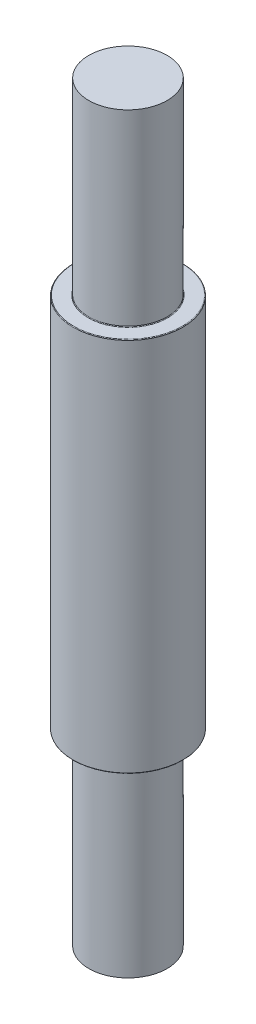
ISO-10303-21;
HEADER;
FILE_DESCRIPTION(('STEP AP214'),'2;1');
FILE_NAME('part.step','',(''),(''),'','','');
FILE_SCHEMA(('AUTOMOTIVE_DESIGN { 1 0 10303 214 1 1 1 1 }'));
ENDSEC;
DATA;
#1=APPLICATION_CONTEXT('core data for automotive mechanical design processes');
#2=APPLICATION_PROTOCOL_DEFINITION('international standard','automotive_design',2000,#1);
#3=PRODUCT_CONTEXT('',#1,'mechanical');
#4=PRODUCT('Part','Part','',(#3));
#5=PRODUCT_RELATED_PRODUCT_CATEGORY('part','',(#4));
#6=PRODUCT_DEFINITION_FORMATION('','',#4);
#7=PRODUCT_DEFINITION_CONTEXT('part definition',#1,'design');
#8=PRODUCT_DEFINITION('design','',#6,#7);
#9=PRODUCT_DEFINITION_SHAPE('','',#8);
#10=(LENGTH_UNIT() NAMED_UNIT(*) SI_UNIT(.MILLI.,.METRE.));
#11=(NAMED_UNIT(*) PLANE_ANGLE_UNIT() SI_UNIT($,.RADIAN.));
#12=(NAMED_UNIT(*) SI_UNIT($,.STERADIAN.) SOLID_ANGLE_UNIT());
#13=UNCERTAINTY_MEASURE_WITH_UNIT(LENGTH_MEASURE(1.E-05),#10,'distance_accuracy_value','');
#14=(GEOMETRIC_REPRESENTATION_CONTEXT(3) GLOBAL_UNCERTAINTY_ASSIGNED_CONTEXT((#13)) GLOBAL_UNIT_ASSIGNED_CONTEXT((#10,
#11,#12)) REPRESENTATION_CONTEXT('',''));
#15=CARTESIAN_POINT('',(0.,0.,0.));
#16=DIRECTION('',(0.,0.,1.));
#17=DIRECTION('',(1.,0.,0.));
#18=AXIS2_PLACEMENT_3D('',#15,#16,#17);
#19=CARTESIAN_POINT('',(0.,76.2,0.));
#20=DIRECTION('',(0.,-1.,0.));
#21=DIRECTION('',(0.,0.,-1.));
#22=AXIS2_PLACEMENT_3D('',#19,#20,#21);
#23=CYLINDRICAL_SURFACE('',#22,15.875);
#24=CARTESIAN_POINT('',(0.,75.946,0.));
#25=DIRECTION('',(0.,1.,0.));
#26=DIRECTION('',(0.,0.,1.));
#27=AXIS2_PLACEMENT_3D('',#24,#25,#26);
#28=CIRCLE('',#27,15.875);
#29=CARTESIAN_POINT('',(0.,75.946,-15.875));
#30=VERTEX_POINT('',#29);
#31=EDGE_CURVE('E72',#30,#30,#28,.F.);
#32=CARTESIAN_POINT('',(0.,0.,0.));
#33=DIRECTION('',(0.,1.,0.));
#34=DIRECTION('',(0.,0.,1.));
#35=AXIS2_PLACEMENT_3D('',#32,#33,#34);
#36=CIRCLE('',#35,15.875);
#37=CARTESIAN_POINT('',(0.,0.,-15.875));
#38=VERTEX_POINT('',#37);
#39=EDGE_CURVE('E78',#38,#38,#36,.T.);
#40=CARTESIAN_POINT('',(0.,75.946,-15.875));
#41=CARTESIAN_POINT('',(0.,75.1548958333333,-15.875));
#42=CARTESIAN_POINT('',(0.,74.3637916666667,-15.875));
#43=CARTESIAN_POINT('',(0.,72.7815833333333,-15.875));
#44=CARTESIAN_POINT('',(0.,71.9904791666667,-15.875));
#45=CARTESIAN_POINT('',(0.,70.4082708333333,-15.875));
#46=CARTESIAN_POINT('',(0.,69.6171666666667,-15.875));
#47=CARTESIAN_POINT('',(0.,68.0349583333333,-15.875));
#48=CARTESIAN_POINT('',(0.,67.2438541666667,-15.875));
#49=CARTESIAN_POINT('',(0.,65.6616458333333,-15.875));
#50=CARTESIAN_POINT('',(0.,64.8705416666667,-15.875));
#51=CARTESIAN_POINT('',(0.,63.2883333333333,-15.875));
#52=CARTESIAN_POINT('',(0.,62.4972291666667,-15.875));
#53=CARTESIAN_POINT('',(0.,60.9150208333333,-15.875));
#54=CARTESIAN_POINT('',(0.,60.1239166666667,-15.875));
#55=CARTESIAN_POINT('',(0.,58.5417083333333,-15.875));
#56=CARTESIAN_POINT('',(0.,57.7506041666667,-15.875));
#57=CARTESIAN_POINT('',(0.,56.1683958333333,-15.875));
#58=CARTESIAN_POINT('',(0.,55.3772916666667,-15.875));
#59=CARTESIAN_POINT('',(0.,53.7950833333333,-15.875));
#60=CARTESIAN_POINT('',(0.,53.0039791666667,-15.875));
#61=CARTESIAN_POINT('',(0.,51.4217708333333,-15.875));
#62=CARTESIAN_POINT('',(0.,50.6306666666667,-15.875));
#63=CARTESIAN_POINT('',(0.,49.0484583333333,-15.875));
#64=CARTESIAN_POINT('',(0.,48.2573541666667,-15.875));
#65=CARTESIAN_POINT('',(0.,46.6751458333333,-15.875));
#66=CARTESIAN_POINT('',(0.,45.8840416666667,-15.875));
#67=CARTESIAN_POINT('',(0.,44.3018333333333,-15.875));
#68=CARTESIAN_POINT('',(0.,43.5107291666667,-15.875));
#69=CARTESIAN_POINT('',(0.,41.9285208333333,-15.875));
#70=CARTESIAN_POINT('',(0.,41.1374166666667,-15.875));
#71=CARTESIAN_POINT('',(0.,39.5552083333333,-15.875));
#72=CARTESIAN_POINT('',(0.,38.7641041666667,-15.875));
#73=CARTESIAN_POINT('',(0.,37.1818958333333,-15.875));
#74=CARTESIAN_POINT('',(0.,36.3907916666667,-15.875));
#75=CARTESIAN_POINT('',(0.,34.8085833333333,-15.875));
#76=CARTESIAN_POINT('',(0.,34.0174791666667,-15.875));
#77=CARTESIAN_POINT('',(0.,32.4352708333333,-15.875));
#78=CARTESIAN_POINT('',(0.,31.6441666666667,-15.875));
#79=CARTESIAN_POINT('',(0.,30.0619583333333,-15.875));
#80=CARTESIAN_POINT('',(0.,29.2708541666667,-15.875));
#81=CARTESIAN_POINT('',(0.,27.6886458333333,-15.875));
#82=CARTESIAN_POINT('',(0.,26.8975416666667,-15.875));
#83=CARTESIAN_POINT('',(0.,25.3153333333333,-15.875));
#84=CARTESIAN_POINT('',(0.,24.5242291666667,-15.875));
#85=CARTESIAN_POINT('',(0.,22.9420208333333,-15.875));
#86=CARTESIAN_POINT('',(0.,22.1509166666667,-15.875));
#87=CARTESIAN_POINT('',(0.,20.5687083333333,-15.875));
#88=CARTESIAN_POINT('',(0.,19.7776041666667,-15.875));
#89=CARTESIAN_POINT('',(0.,18.1953958333333,-15.875));
#90=CARTESIAN_POINT('',(0.,17.4042916666667,-15.875));
#91=CARTESIAN_POINT('',(0.,15.8220833333333,-15.875));
#92=CARTESIAN_POINT('',(0.,15.0309791666667,-15.875));
#93=CARTESIAN_POINT('',(0.,13.4487708333333,-15.875));
#94=CARTESIAN_POINT('',(0.,12.6576666666666,-15.875));
#95=CARTESIAN_POINT('',(0.,11.0754583333333,-15.875));
#96=CARTESIAN_POINT('',(0.,10.2843541666667,-15.875));
#97=CARTESIAN_POINT('',(0.,8.70214583333334,-15.875));
#98=CARTESIAN_POINT('',(0.,7.91104166666667,-15.875));
#99=CARTESIAN_POINT('',(0.,6.32883333333334,-15.875));
#100=CARTESIAN_POINT('',(0.,5.53772916666667,-15.875));
#101=CARTESIAN_POINT('',(0.,3.95552083333334,-15.875));
#102=CARTESIAN_POINT('',(0.,3.16441666666667,-15.875));
#103=CARTESIAN_POINT('',(0.,1.58220833333333,-15.875));
#104=CARTESIAN_POINT('',(0.,0.791104166666667,-15.875));
#105=CARTESIAN_POINT('',(0.,0.,-15.875));
#106=B_SPLINE_CURVE_WITH_KNOTS('',3,(#40,#41,#42,#43,#44,#45,#46,#47,#48,#49,#50,#51,#52,#53,
#54,#55,#56,#57,#58,#59,#60,#61,#62,#63,#64,#65,#66,#67,#68,#69,#70,#71,#72,#73,#74,#75,#76,#77,
#78,#79,#80,#81,#82,#83,#84,#85,#86,#87,#88,#89,#90,#91,#92,#93,#94,#95,#96,#97,#98,#99,#100,
#101,#102,#103,#104,#105),.UNSPECIFIED.,.F.,.F.,(4,2,2,2,2,2,2,2,2,2,2,2,2,2,2,2,2,2,2,2,2,2,2,
2,2,2,2,2,2,2,2,2,4),(0.,2.3733125,4.746625,7.11993750000001,9.49325000000001,11.8665625,
14.239875,16.6131875,18.9865,21.3598125,23.733125,26.1064375,28.47975,30.8530625,33.226375,
35.5996875,37.973,40.3463125,42.719625,45.0929375,47.46625,49.8395625,52.212875,54.5861875,
56.9595,59.3328125,61.706125,64.0794375,66.45275,68.8260625,71.199375,73.5726875,75.946),.UNSPECIFIED.);
#107=EDGE_CURVE('BSEAM46',#30,#38,#106,.T.);
#108=ORIENTED_EDGE('',*,*,#31,.T.);
#109=ORIENTED_EDGE('',*,*,#39,.T.);
#110=ORIENTED_EDGE('',*,*,#107,.T.);
#111=ORIENTED_EDGE('',*,*,#107,.F.);
#112=EDGE_LOOP('',(#108,#110,#109,#111));
#113=FACE_BOUND('',#112,.T.);
#114=ADVANCED_FACE('F46',(#113),#23,.T.);
#115=CARTESIAN_POINT('',(0.,0.,0.));
#116=DIRECTION('',(0.,1.,0.));
#117=DIRECTION('',(0.,0.,1.));
#118=AXIS2_PLACEMENT_3D('',#115,#116,#117);
#119=PLANE('',#118);
#120=ORIENTED_EDGE('',*,*,#39,.F.);
#121=EDGE_LOOP('',(#120));
#122=FACE_BOUND('',#121,.T.);
#123=ADVANCED_FACE('F102',(#122),#119,.F.);
#124=CARTESIAN_POINT('',(0.,228.6,0.));
#125=DIRECTION('',(0.,-1.,0.));
#126=DIRECTION('',(0.,0.,-1.));
#127=AXIS2_PLACEMENT_3D('',#124,#125,#126);
#128=CYLINDRICAL_SURFACE('',#127,22.225);
#129=CARTESIAN_POINT('',(0.,76.454,0.));
#130=DIRECTION('',(0.,1.,0.));
#131=DIRECTION('',(0.,0.,1.));
#132=AXIS2_PLACEMENT_3D('',#129,#130,#131);
#133=CIRCLE('',#132,22.225);
#134=CARTESIAN_POINT('',(0.,76.454,-22.225));
#135=VERTEX_POINT('',#134);
#136=EDGE_CURVE('E53',#135,#135,#133,.T.);
#137=CARTESIAN_POINT('',(0.,228.346,0.));
#138=DIRECTION('',(0.,1.,0.));
#139=DIRECTION('',(0.,0.,1.));
#140=AXIS2_PLACEMENT_3D('',#137,#138,#139);
#141=CIRCLE('',#140,22.225);
#142=CARTESIAN_POINT('',(0.,228.346,-22.225));
#143=VERTEX_POINT('',#142);
#144=EDGE_CURVE('E57',#143,#143,#141,.F.);
#145=CARTESIAN_POINT('',(0.,76.454,-22.225));
#146=CARTESIAN_POINT('',(0.,78.0362083333333,-22.225));
#147=CARTESIAN_POINT('',(0.,79.6184166666667,-22.225));
#148=CARTESIAN_POINT('',(0.,82.7828333333333,-22.225));
#149=CARTESIAN_POINT('',(0.,84.3650416666667,-22.225));
#150=CARTESIAN_POINT('',(0.,87.5294583333333,-22.225));
#151=CARTESIAN_POINT('',(0.,89.1116666666667,-22.225));
#152=CARTESIAN_POINT('',(0.,92.2760833333333,-22.225));
#153=CARTESIAN_POINT('',(0.,93.8582916666667,-22.225));
#154=CARTESIAN_POINT('',(0.,97.0227083333333,-22.225));
#155=CARTESIAN_POINT('',(0.,98.6049166666667,-22.225));
#156=CARTESIAN_POINT('',(0.,101.769333333333,-22.225));
#157=CARTESIAN_POINT('',(0.,103.351541666667,-22.225));
#158=CARTESIAN_POINT('',(0.,106.515958333333,-22.225));
#159=CARTESIAN_POINT('',(0.,108.098166666667,-22.225));
#160=CARTESIAN_POINT('',(0.,111.262583333333,-22.225));
#161=CARTESIAN_POINT('',(0.,112.844791666667,-22.225));
#162=CARTESIAN_POINT('',(0.,116.009208333333,-22.225));
#163=CARTESIAN_POINT('',(0.,117.591416666667,-22.225));
#164=CARTESIAN_POINT('',(0.,120.755833333333,-22.225));
#165=CARTESIAN_POINT('',(0.,122.338041666667,-22.225));
#166=CARTESIAN_POINT('',(0.,125.502458333333,-22.225));
#167=CARTESIAN_POINT('',(0.,127.084666666667,-22.225));
#168=CARTESIAN_POINT('',(0.,130.249083333333,-22.225));
#169=CARTESIAN_POINT('',(0.,131.831291666667,-22.225));
#170=CARTESIAN_POINT('',(0.,134.995708333333,-22.225));
#171=CARTESIAN_POINT('',(0.,136.577916666667,-22.225));
#172=CARTESIAN_POINT('',(0.,139.742333333333,-22.225));
#173=CARTESIAN_POINT('',(0.,141.324541666667,-22.225));
#174=CARTESIAN_POINT('',(0.,144.488958333333,-22.225));
#175=CARTESIAN_POINT('',(0.,146.071166666667,-22.225));
#176=CARTESIAN_POINT('',(0.,149.235583333333,-22.225));
#177=CARTESIAN_POINT('',(0.,150.817791666667,-22.225));
#178=CARTESIAN_POINT('',(0.,153.982208333333,-22.225));
#179=CARTESIAN_POINT('',(0.,155.564416666667,-22.225));
#180=CARTESIAN_POINT('',(0.,158.728833333333,-22.225));
#181=CARTESIAN_POINT('',(0.,160.311041666667,-22.225));
#182=CARTESIAN_POINT('',(0.,163.475458333333,-22.225));
#183=CARTESIAN_POINT('',(0.,165.057666666667,-22.225));
#184=CARTESIAN_POINT('',(0.,168.222083333333,-22.225));
#185=CARTESIAN_POINT('',(0.,169.804291666667,-22.225));
#186=CARTESIAN_POINT('',(0.,172.968708333333,-22.225));
#187=CARTESIAN_POINT('',(0.,174.550916666667,-22.225));
#188=CARTESIAN_POINT('',(0.,177.715333333333,-22.225));
#189=CARTESIAN_POINT('',(0.,179.297541666667,-22.225));
#190=CARTESIAN_POINT('',(0.,182.461958333333,-22.225));
#191=CARTESIAN_POINT('',(0.,184.044166666667,-22.225));
#192=CARTESIAN_POINT('',(0.,187.208583333333,-22.225));
#193=CARTESIAN_POINT('',(0.,188.790791666667,-22.225));
#194=CARTESIAN_POINT('',(0.,191.955208333333,-22.225));
#195=CARTESIAN_POINT('',(0.,193.537416666667,-22.225));
#196=CARTESIAN_POINT('',(0.,196.701833333333,-22.225));
#197=CARTESIAN_POINT('',(0.,198.284041666667,-22.225));
#198=CARTESIAN_POINT('',(0.,201.448458333333,-22.225));
#199=CARTESIAN_POINT('',(0.,203.030666666667,-22.225));
#200=CARTESIAN_POINT('',(0.,206.195083333333,-22.225));
#201=CARTESIAN_POINT('',(0.,207.777291666667,-22.225));
#202=CARTESIAN_POINT('',(0.,210.941708333333,-22.225));
#203=CARTESIAN_POINT('',(0.,212.523916666667,-22.225));
#204=CARTESIAN_POINT('',(0.,215.688333333333,-22.225));
#205=CARTESIAN_POINT('',(0.,217.270541666667,-22.225));
#206=CARTESIAN_POINT('',(0.,220.434958333333,-22.225));
#207=CARTESIAN_POINT('',(0.,222.017166666667,-22.225));
#208=CARTESIAN_POINT('',(0.,225.181583333333,-22.225));
#209=CARTESIAN_POINT('',(0.,226.763791666667,-22.225));
#210=CARTESIAN_POINT('',(0.,228.346,-22.225));
#211=B_SPLINE_CURVE_WITH_KNOTS('',3,(#145,#146,#147,#148,#149,#150,#151,#152,#153,#154,#155,
#156,#157,#158,#159,#160,#161,#162,#163,#164,#165,#166,#167,#168,#169,#170,#171,#172,#173,#174,
#175,#176,#177,#178,#179,#180,#181,#182,#183,#184,#185,#186,#187,#188,#189,#190,#191,#192,#193,
#194,#195,#196,#197,#198,#199,#200,#201,#202,#203,#204,#205,#206,#207,#208,#209,#210),
.UNSPECIFIED.,.F.,.F.,(4,2,2,2,2,2,2,2,2,2,2,2,2,2,2,2,2,2,2,2,2,2,2,2,2,2,2,2,2,2,2,2,4),(0.,
4.746625,9.49325000000001,14.239875,18.9865,23.733125,28.47975,33.226375,37.973,42.719625,
47.46625,52.212875,56.9595,61.706125,66.45275,71.199375,75.946,80.692625,85.43925,90.185875,
94.9325,99.679125,104.42575,109.172375,113.919,118.665625,123.41225,128.158875,132.9055,
137.652125,142.39875,147.145375,151.892),.UNSPECIFIED.);
#212=EDGE_CURVE('BSEAM108',#135,#143,#211,.T.);
#213=ORIENTED_EDGE('',*,*,#136,.T.);
#214=ORIENTED_EDGE('',*,*,#144,.T.);
#215=ORIENTED_EDGE('',*,*,#212,.T.);
#216=ORIENTED_EDGE('',*,*,#212,.F.);
#217=EDGE_LOOP('',(#213,#215,#214,#216));
#218=FACE_BOUND('',#217,.T.);
#219=ADVANCED_FACE('F108',(#218),#128,.T.);
#220=CARTESIAN_POINT('',(0.,228.6,0.));
#221=DIRECTION('',(0.,1.,0.));
#222=DIRECTION('',(0.,0.,1.));
#223=AXIS2_PLACEMENT_3D('',#220,#221,#222);
#224=PLANE('',#223);
#225=CARTESIAN_POINT('',(0.,228.6,0.));
#226=DIRECTION('',(0.,1.,0.));
#227=DIRECTION('',(0.,0.,1.));
#228=AXIS2_PLACEMENT_3D('',#225,#226,#227);
#229=CIRCLE('',#228,21.971);
#230=CARTESIAN_POINT('',(0.,228.6,21.971));
#231=VERTEX_POINT('',#230);
#232=EDGE_CURVE('E61',#231,#231,#229,.T.);
#233=ORIENTED_EDGE('',*,*,#232,.T.);
#234=EDGE_LOOP('',(#233));
#235=FACE_BOUND('',#234,.T.);
#236=CARTESIAN_POINT('',(0.,228.6,0.));
#237=DIRECTION('',(0.,1.,0.));
#238=DIRECTION('',(0.,0.,1.));
#239=AXIS2_PLACEMENT_3D('',#236,#237,#238);
#240=CIRCLE('',#239,16.129);
#241=CARTESIAN_POINT('',(0.,228.6,16.129));
#242=VERTEX_POINT('',#241);
#243=EDGE_CURVE('E66',#242,#242,#240,.F.);
#244=ORIENTED_EDGE('',*,*,#243,.T.);
#245=EDGE_LOOP('',(#244));
#246=FACE_BOUND('',#245,.T.);
#247=ADVANCED_FACE('F98',(#235,#246),#224,.T.);
#248=CARTESIAN_POINT('',(0.,76.2,0.));
#249=DIRECTION('',(0.,1.,0.));
#250=DIRECTION('',(0.,0.,1.));
#251=AXIS2_PLACEMENT_3D('',#248,#249,#250);
#252=PLANE('',#251);
#253=CARTESIAN_POINT('',(0.,76.2,0.));
#254=DIRECTION('',(0.,1.,0.));
#255=DIRECTION('',(0.,0.,1.));
#256=AXIS2_PLACEMENT_3D('',#253,#254,#255);
#257=CIRCLE('',#256,21.971);
#258=CARTESIAN_POINT('',(0.,76.2,21.971));
#259=VERTEX_POINT('',#258);
#260=EDGE_CURVE('E12',#259,#259,#257,.F.);
#261=ORIENTED_EDGE('',*,*,#260,.T.);
#262=EDGE_LOOP('',(#261));
#263=FACE_BOUND('',#262,.T.);
#264=CARTESIAN_POINT('',(0.,76.2,0.));
#265=DIRECTION('',(0.,1.,0.));
#266=DIRECTION('',(0.,0.,1.));
#267=AXIS2_PLACEMENT_3D('',#264,#265,#266);
#268=CIRCLE('',#267,16.129);
#269=CARTESIAN_POINT('',(0.,76.2,16.129));
#270=VERTEX_POINT('',#269);
#271=EDGE_CURVE('E75',#270,#270,#268,.T.);
#272=ORIENTED_EDGE('',*,*,#271,.T.);
#273=EDGE_LOOP('',(#272));
#274=FACE_BOUND('',#273,.T.);
#275=ADVANCED_FACE('F89',(#263,#274),#252,.F.);
#276=CARTESIAN_POINT('',(0.,304.8,0.));
#277=DIRECTION('',(0.,-1.,0.));
#278=DIRECTION('',(0.,0.,-1.));
#279=AXIS2_PLACEMENT_3D('',#276,#277,#278);
#280=CYLINDRICAL_SURFACE('',#279,15.875);
#281=CARTESIAN_POINT('',(0.,228.854,0.));
#282=DIRECTION('',(0.,1.,0.));
#283=DIRECTION('',(0.,0.,1.));
#284=AXIS2_PLACEMENT_3D('',#281,#282,#283);
#285=CIRCLE('',#284,15.875);
#286=CARTESIAN_POINT('',(0.,228.854,-15.875));
#287=VERTEX_POINT('',#286);
#288=EDGE_CURVE('E69',#287,#287,#285,.T.);
#289=CARTESIAN_POINT('',(0.,304.8,0.));
#290=DIRECTION('',(0.,1.,0.));
#291=DIRECTION('',(0.,0.,1.));
#292=AXIS2_PLACEMENT_3D('',#289,#290,#291);
#293=CIRCLE('',#292,15.875);
#294=CARTESIAN_POINT('',(0.,304.8,-15.875));
#295=VERTEX_POINT('',#294);
#296=EDGE_CURVE('E81',#295,#295,#293,.T.);
#297=CARTESIAN_POINT('',(0.,228.854,-15.875));
#298=CARTESIAN_POINT('',(0.,229.645104166667,-15.875));
#299=CARTESIAN_POINT('',(0.,230.436208333333,-15.875));
#300=CARTESIAN_POINT('',(0.,232.018416666667,-15.875));
#301=CARTESIAN_POINT('',(0.,232.809520833333,-15.875));
#302=CARTESIAN_POINT('',(0.,234.391729166667,-15.875));
#303=CARTESIAN_POINT('',(0.,235.182833333333,-15.875));
#304=CARTESIAN_POINT('',(0.,236.765041666667,-15.875));
#305=CARTESIAN_POINT('',(0.,237.556145833333,-15.875));
#306=CARTESIAN_POINT('',(0.,239.138354166667,-15.875));
#307=CARTESIAN_POINT('',(0.,239.929458333333,-15.875));
#308=CARTESIAN_POINT('',(0.,241.511666666667,-15.875));
#309=CARTESIAN_POINT('',(0.,242.302770833333,-15.875));
#310=CARTESIAN_POINT('',(0.,243.884979166667,-15.875));
#311=CARTESIAN_POINT('',(0.,244.676083333333,-15.875));
#312=CARTESIAN_POINT('',(0.,246.258291666667,-15.875));
#313=CARTESIAN_POINT('',(0.,247.049395833333,-15.875));
#314=CARTESIAN_POINT('',(0.,248.631604166667,-15.875));
#315=CARTESIAN_POINT('',(0.,249.422708333333,-15.875));
#316=CARTESIAN_POINT('',(0.,251.004916666667,-15.875));
#317=CARTESIAN_POINT('',(0.,251.796020833333,-15.875));
#318=CARTESIAN_POINT('',(0.,253.378229166667,-15.875));
#319=CARTESIAN_POINT('',(0.,254.169333333333,-15.875));
#320=CARTESIAN_POINT('',(0.,255.751541666667,-15.875));
#321=CARTESIAN_POINT('',(0.,256.542645833333,-15.875));
#322=CARTESIAN_POINT('',(0.,258.124854166667,-15.875));
#323=CARTESIAN_POINT('',(0.,258.915958333333,-15.875));
#324=CARTESIAN_POINT('',(0.,260.498166666667,-15.875));
#325=CARTESIAN_POINT('',(0.,261.289270833333,-15.875));
#326=CARTESIAN_POINT('',(0.,262.871479166667,-15.875));
#327=CARTESIAN_POINT('',(0.,263.662583333333,-15.875));
#328=CARTESIAN_POINT('',(0.,265.244791666667,-15.875));
#329=CARTESIAN_POINT('',(0.,266.035895833333,-15.875));
#330=CARTESIAN_POINT('',(0.,267.618104166667,-15.875));
#331=CARTESIAN_POINT('',(0.,268.409208333333,-15.875));
#332=CARTESIAN_POINT('',(0.,269.991416666667,-15.875));
#333=CARTESIAN_POINT('',(0.,270.782520833333,-15.875));
#334=CARTESIAN_POINT('',(0.,272.364729166667,-15.875));
#335=CARTESIAN_POINT('',(0.,273.155833333333,-15.875));
#336=CARTESIAN_POINT('',(0.,274.738041666667,-15.875));
#337=CARTESIAN_POINT('',(0.,275.529145833333,-15.875));
#338=CARTESIAN_POINT('',(0.,277.111354166667,-15.875));
#339=CARTESIAN_POINT('',(0.,277.902458333333,-15.875));
#340=CARTESIAN_POINT('',(0.,279.484666666667,-15.875));
#341=CARTESIAN_POINT('',(0.,280.275770833333,-15.875));
#342=CARTESIAN_POINT('',(0.,281.857979166667,-15.875));
#343=CARTESIAN_POINT('',(0.,282.649083333333,-15.875));
#344=CARTESIAN_POINT('',(0.,284.231291666667,-15.875));
#345=CARTESIAN_POINT('',(0.,285.022395833333,-15.875));
#346=CARTESIAN_POINT('',(0.,286.604604166667,-15.875));
#347=CARTESIAN_POINT('',(0.,287.395708333333,-15.875));
#348=CARTESIAN_POINT('',(0.,288.977916666667,-15.875));
#349=CARTESIAN_POINT('',(0.,289.769020833333,-15.875));
#350=CARTESIAN_POINT('',(0.,291.351229166667,-15.875));
#351=CARTESIAN_POINT('',(0.,292.142333333333,-15.875));
#352=CARTESIAN_POINT('',(0.,293.724541666667,-15.875));
#353=CARTESIAN_POINT('',(0.,294.515645833333,-15.875));
#354=CARTESIAN_POINT('',(0.,296.097854166667,-15.875));
#355=CARTESIAN_POINT('',(0.,296.888958333333,-15.875));
#356=CARTESIAN_POINT('',(0.,298.471166666667,-15.875));
#357=CARTESIAN_POINT('',(0.,299.262270833333,-15.875));
#358=CARTESIAN_POINT('',(0.,300.844479166667,-15.875));
#359=CARTESIAN_POINT('',(0.,301.635583333333,-15.875));
#360=CARTESIAN_POINT('',(0.,303.217791666667,-15.875));
#361=CARTESIAN_POINT('',(0.,304.008895833333,-15.875));
#362=CARTESIAN_POINT('',(0.,304.8,-15.875));
#363=B_SPLINE_CURVE_WITH_KNOTS('',3,(#297,#298,#299,#300,#301,#302,#303,#304,#305,#306,#307,
#308,#309,#310,#311,#312,#313,#314,#315,#316,#317,#318,#319,#320,#321,#322,#323,#324,#325,#326,
#327,#328,#329,#330,#331,#332,#333,#334,#335,#336,#337,#338,#339,#340,#341,#342,#343,#344,#345,
#346,#347,#348,#349,#350,#351,#352,#353,#354,#355,#356,#357,#358,#359,#360,#361,#362),
.UNSPECIFIED.,.F.,.F.,(4,2,2,2,2,2,2,2,2,2,2,2,2,2,2,2,2,2,2,2,2,2,2,2,2,2,2,2,2,2,2,2,4),(0.,
2.3733125,4.746625,7.11993750000001,9.49325000000001,11.8665625,14.239875,16.6131875,18.9865,
21.3598125,23.733125,26.1064375,28.47975,30.8530625,33.226375,35.5996875,37.973,40.3463125,
42.719625,45.0929375,47.46625,49.8395625,52.212875,54.5861875,56.9595,59.3328125,61.706125,
64.0794375,66.45275,68.8260625,71.199375,73.5726875,75.946),.UNSPECIFIED.);
#364=EDGE_CURVE('BSEAM87',#287,#295,#363,.T.);
#365=ORIENTED_EDGE('',*,*,#288,.T.);
#366=ORIENTED_EDGE('',*,*,#296,.F.);
#367=ORIENTED_EDGE('',*,*,#364,.T.);
#368=ORIENTED_EDGE('',*,*,#364,.F.);
#369=EDGE_LOOP('',(#365,#367,#366,#368));
#370=FACE_BOUND('',#369,.T.);
#371=ADVANCED_FACE('F87',(#370),#280,.T.);
#372=CARTESIAN_POINT('',(0.,304.8,0.));
#373=DIRECTION('',(0.,1.,0.));
#374=DIRECTION('',(0.,0.,1.));
#375=AXIS2_PLACEMENT_3D('',#372,#373,#374);
#376=PLANE('',#375);
#377=ORIENTED_EDGE('',*,*,#296,.T.);
#378=EDGE_LOOP('',(#377));
#379=FACE_BOUND('',#378,.T.);
#380=ADVANCED_FACE('F85',(#379),#376,.T.);
#381=CARTESIAN_POINT('',(0.,75.946,0.));
#382=DIRECTION('',(0.,1.,0.));
#383=DIRECTION('',(0.,0.,1.));
#384=AXIS2_PLACEMENT_3D('',#381,#382,#383);
#385=TOROIDAL_SURFACE('',#384,16.129,0.254);
#386=ORIENTED_EDGE('',*,*,#31,.F.);
#387=EDGE_LOOP('',(#386));
#388=FACE_BOUND('',#387,.T.);
#389=ORIENTED_EDGE('',*,*,#271,.F.);
#390=EDGE_LOOP('',(#389));
#391=FACE_BOUND('',#390,.T.);
#392=ADVANCED_FACE('F96',(#388,#391),#385,.F.);
#393=CARTESIAN_POINT('',(0.,228.854,0.));
#394=DIRECTION('',(0.,1.,0.));
#395=DIRECTION('',(0.,0.,1.));
#396=AXIS2_PLACEMENT_3D('',#393,#394,#395);
#397=TOROIDAL_SURFACE('',#396,16.129,0.254);
#398=ORIENTED_EDGE('',*,*,#243,.F.);
#399=EDGE_LOOP('',(#398));
#400=FACE_BOUND('',#399,.T.);
#401=ORIENTED_EDGE('',*,*,#288,.F.);
#402=EDGE_LOOP('',(#401));
#403=FACE_BOUND('',#402,.T.);
#404=ADVANCED_FACE('F116',(#400,#403),#397,.F.);
#405=CARTESIAN_POINT('',(0.,228.346,0.));
#406=DIRECTION('',(0.,1.,0.));
#407=DIRECTION('',(0.,0.,1.));
#408=AXIS2_PLACEMENT_3D('',#405,#406,#407);
#409=TOROIDAL_SURFACE('',#408,21.971,0.254);
#410=ORIENTED_EDGE('',*,*,#144,.F.);
#411=EDGE_LOOP('',(#410));
#412=FACE_BOUND('',#411,.T.);
#413=ORIENTED_EDGE('',*,*,#232,.F.);
#414=EDGE_LOOP('',(#413));
#415=FACE_BOUND('',#414,.T.);
#416=ADVANCED_FACE('F119',(#412,#415),#409,.T.);
#417=CARTESIAN_POINT('',(0.,76.454,0.));
#418=DIRECTION('',(0.,1.,0.));
#419=DIRECTION('',(0.,0.,1.));
#420=AXIS2_PLACEMENT_3D('',#417,#418,#419);
#421=TOROIDAL_SURFACE('',#420,21.971,0.254);
#422=ORIENTED_EDGE('',*,*,#260,.F.);
#423=EDGE_LOOP('',(#422));
#424=FACE_BOUND('',#423,.T.);
#425=ORIENTED_EDGE('',*,*,#136,.F.);
#426=EDGE_LOOP('',(#425));
#427=FACE_BOUND('',#426,.T.);
#428=ADVANCED_FACE('F48',(#424,#427),#421,.T.);
#429=CLOSED_SHELL('',(#114,#123,#219,#247,#275,#371,#380,#392,#404,#416,#428));
#430=MANIFOLD_SOLID_BREP('B2',#429);
#431=ADVANCED_BREP_SHAPE_REPRESENTATION('',(#18,#430),#14);
#432=SHAPE_DEFINITION_REPRESENTATION(#9,#431);
ENDSEC;
END-ISO-10303-21;
